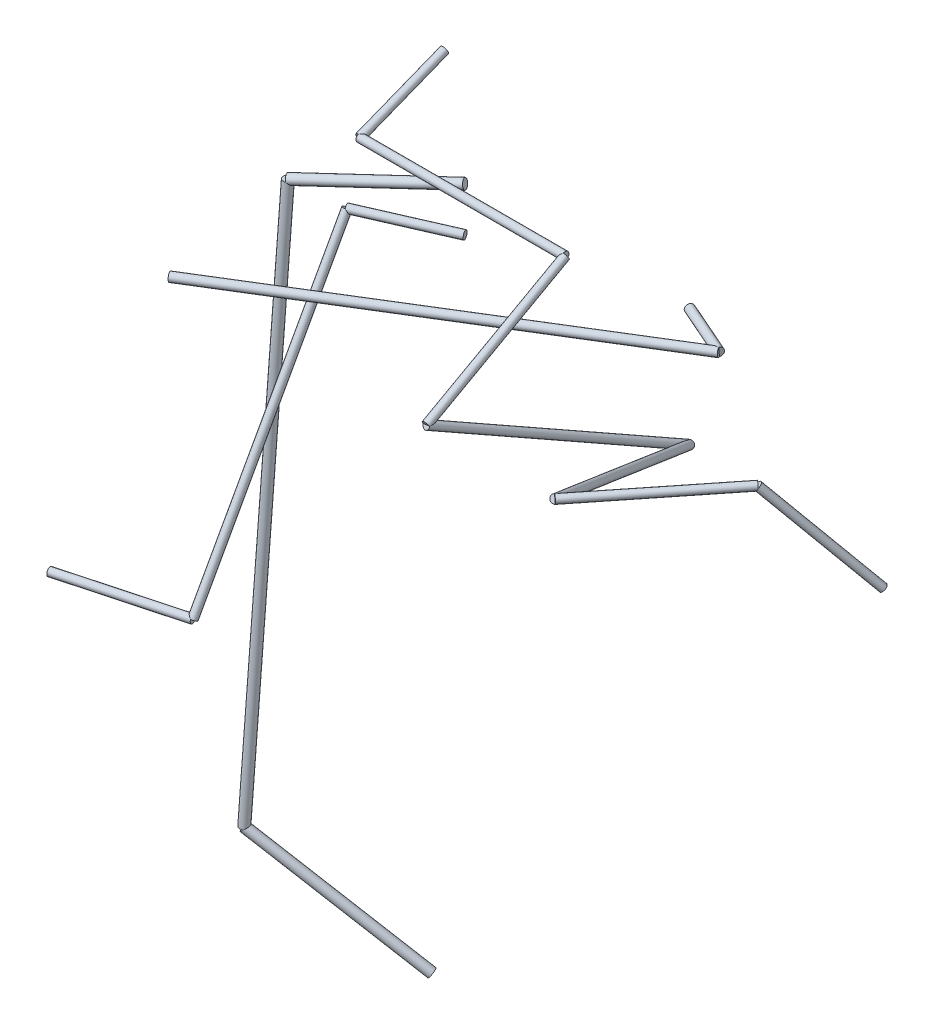
ISO-10303-21;
HEADER;
FILE_DESCRIPTION(('STEP AP214'),'2;1');
FILE_NAME('part.step','',(''),(''),'','','');
FILE_SCHEMA(('AUTOMOTIVE_DESIGN { 1 0 10303 214 1 1 1 1 }'));
ENDSEC;
DATA;
#1=APPLICATION_CONTEXT('core data for automotive mechanical design processes');
#2=APPLICATION_PROTOCOL_DEFINITION('international standard','automotive_design',2000,#1);
#3=PRODUCT_CONTEXT('',#1,'mechanical');
#4=PRODUCT('Part','Part','',(#3));
#5=PRODUCT_RELATED_PRODUCT_CATEGORY('part','',(#4));
#6=PRODUCT_DEFINITION_FORMATION('','',#4);
#7=PRODUCT_DEFINITION_CONTEXT('part definition',#1,'design');
#8=PRODUCT_DEFINITION('design','',#6,#7);
#9=PRODUCT_DEFINITION_SHAPE('','',#8);
#10=(LENGTH_UNIT() NAMED_UNIT(*) SI_UNIT(.MILLI.,.METRE.));
#11=(NAMED_UNIT(*) PLANE_ANGLE_UNIT() SI_UNIT($,.RADIAN.));
#12=(NAMED_UNIT(*) SI_UNIT($,.STERADIAN.) SOLID_ANGLE_UNIT());
#13=UNCERTAINTY_MEASURE_WITH_UNIT(LENGTH_MEASURE(1.E-05),#10,'distance_accuracy_value','');
#14=(GEOMETRIC_REPRESENTATION_CONTEXT(3) GLOBAL_UNCERTAINTY_ASSIGNED_CONTEXT((#13)) GLOBAL_UNIT_ASSIGNED_CONTEXT((#10,
#11,#12)) REPRESENTATION_CONTEXT('',''));
#15=CARTESIAN_POINT('',(0.,0.,0.));
#16=DIRECTION('',(0.,0.,1.));
#17=DIRECTION('',(1.,0.,0.));
#18=AXIS2_PLACEMENT_3D('',#15,#16,#17);
#19=CARTESIAN_POINT('',(-90.,105.,58.));
#20=DIRECTION('',(-0.886515391854037,-0.204977163864712,0.414819023551069));
#21=DIRECTION('',(0.423818055819128,0.,0.905747346428183));
#22=AXIS2_PLACEMENT_3D('',#19,#20,#21);
#23=PLANE('',#22);
#24=CARTESIAN_POINT('',(-90.,105.,58.));
#25=DIRECTION('',(0.886515391854037,0.204977163864712,-0.414819023551069));
#26=DIRECTION('',(-0.423818055819128,0.,-0.905747346428183));
#27=AXIS2_PLACEMENT_3D('',#24,#25,#26);
#28=CIRCLE('',#27,1.8);
#29=CARTESIAN_POINT('',(-89.2371274995256,105.,59.6303452235707));
#30=VERTEX_POINT('',#29);
#31=EDGE_CURVE('P0_E10',#30,#30,#28,.T.);
#32=ORIENTED_EDGE('',*,*,#31,.F.);
#33=EDGE_LOOP('',(#32));
#34=FACE_BOUND('',#33,.T.);
#35=ADVANCED_FACE('P0_F15',(#34),#23,.T.);
#36=CARTESIAN_POINT('',(-42.9835,115.871,36.));
#37=DIRECTION('',(0.886515391854037,0.204977163864712,-0.414819023551069));
#38=DIRECTION('',(-0.423818055819128,0.,-0.905747346428183));
#39=AXIS2_PLACEMENT_3D('',#36,#37,#38);
#40=PLANE('',#39);
#41=CARTESIAN_POINT('',(-42.9835,115.871,36.));
#42=DIRECTION('',(-0.886515391854037,-0.204977163864712,0.414819023551069));
#43=DIRECTION('',(0.423818055819128,0.,0.905747346428183));
#44=AXIS2_PLACEMENT_3D('',#41,#42,#43);
#45=CIRCLE('',#44,1.8);
#46=CARTESIAN_POINT('',(-42.2206274995256,115.871,37.6303452235707));
#47=VERTEX_POINT('',#46);
#48=EDGE_CURVE('P0_E22',#47,#47,#45,.T.);
#49=ORIENTED_EDGE('',*,*,#48,.F.);
#50=EDGE_LOOP('',(#49));
#51=FACE_BOUND('',#50,.T.);
#52=ADVANCED_FACE('P0_F26',(#51),#40,.T.);
#53=CARTESIAN_POINT('',(-42.9835,115.871,36.));
#54=DIRECTION('',(-0.886515391854037,-0.204977163864712,0.414819023551069));
#55=DIRECTION('',(0.423818055819128,0.,0.905747346428183));
#56=AXIS2_PLACEMENT_3D('',#53,#54,#55);
#57=CYLINDRICAL_SURFACE('',#56,1.8);
#58=CARTESIAN_POINT('',(-89.2371274995256,105.,59.6303452235707));
#59=CARTESIAN_POINT('',(-88.7473722911922,105.113239583333,59.4011785569041));
#60=CARTESIAN_POINT('',(-88.2576170828589,105.226479166667,59.1720118902374));
#61=CARTESIAN_POINT('',(-87.2781066661922,105.452958333333,58.7136785569041));
#62=CARTESIAN_POINT('',(-86.7883514578589,105.566197916667,58.4845118902374));
#63=CARTESIAN_POINT('',(-85.8088410411922,105.792677083333,58.0261785569041));
#64=CARTESIAN_POINT('',(-85.3190858328589,105.905916666667,57.7970118902374));
#65=CARTESIAN_POINT('',(-84.3395754161922,106.132395833333,57.3386785569041));
#66=CARTESIAN_POINT('',(-83.8498202078589,106.245635416667,57.1095118902374));
#67=CARTESIAN_POINT('',(-82.8703097911922,106.472114583333,56.6511785569041));
#68=CARTESIAN_POINT('',(-82.3805545828589,106.585354166667,56.4220118902374));
#69=CARTESIAN_POINT('',(-81.4010441661922,106.811833333333,55.9636785569041));
#70=CARTESIAN_POINT('',(-80.9112889578589,106.925072916667,55.7345118902374));
#71=CARTESIAN_POINT('',(-79.9317785411922,107.151552083333,55.2761785569041));
#72=CARTESIAN_POINT('',(-79.4420233328589,107.264791666667,55.0470118902374));
#73=CARTESIAN_POINT('',(-78.4625129161922,107.491270833333,54.5886785569041));
#74=CARTESIAN_POINT('',(-77.9727577078589,107.604510416667,54.3595118902374));
#75=CARTESIAN_POINT('',(-76.9932472911922,107.830989583333,53.9011785569041));
#76=CARTESIAN_POINT('',(-76.5034920828589,107.944229166667,53.6720118902374));
#77=CARTESIAN_POINT('',(-75.5239816661922,108.170708333333,53.2136785569041));
#78=CARTESIAN_POINT('',(-75.0342264578589,108.283947916667,52.9845118902374));
#79=CARTESIAN_POINT('',(-74.0547160411922,108.510427083333,52.5261785569041));
#80=CARTESIAN_POINT('',(-73.5649608328589,108.623666666667,52.2970118902374));
#81=CARTESIAN_POINT('',(-72.5854504161922,108.850145833333,51.8386785569041));
#82=CARTESIAN_POINT('',(-72.0956952078589,108.963385416667,51.6095118902374));
#83=CARTESIAN_POINT('',(-71.1161847911922,109.189864583333,51.1511785569041));
#84=CARTESIAN_POINT('',(-70.6264295828589,109.303104166667,50.9220118902374));
#85=CARTESIAN_POINT('',(-69.6469191661922,109.529583333333,50.4636785569041));
#86=CARTESIAN_POINT('',(-69.1571639578589,109.642822916667,50.2345118902374));
#87=CARTESIAN_POINT('',(-68.1776535411922,109.869302083333,49.7761785569041));
#88=CARTESIAN_POINT('',(-67.6878983328589,109.982541666667,49.5470118902374));
#89=CARTESIAN_POINT('',(-66.7083879161922,110.209020833333,49.0886785569041));
#90=CARTESIAN_POINT('',(-66.2186327078589,110.322260416667,48.8595118902374));
#91=CARTESIAN_POINT('',(-65.2391222911922,110.548739583333,48.4011785569041));
#92=CARTESIAN_POINT('',(-64.7493670828589,110.661979166667,48.1720118902374));
#93=CARTESIAN_POINT('',(-63.7698566661922,110.888458333333,47.7136785569041));
#94=CARTESIAN_POINT('',(-63.2801014578589,111.001697916667,47.4845118902374));
#95=CARTESIAN_POINT('',(-62.3005910411922,111.228177083333,47.0261785569041));
#96=CARTESIAN_POINT('',(-61.8108358328589,111.341416666667,46.7970118902374));
#97=CARTESIAN_POINT('',(-60.8313254161922,111.567895833333,46.3386785569041));
#98=CARTESIAN_POINT('',(-60.3415702078589,111.681135416667,46.1095118902374));
#99=CARTESIAN_POINT('',(-59.3620597911922,111.907614583333,45.6511785569041));
#100=CARTESIAN_POINT('',(-58.8723045828589,112.020854166667,45.4220118902374));
#101=CARTESIAN_POINT('',(-57.8927941661922,112.247333333333,44.9636785569041));
#102=CARTESIAN_POINT('',(-57.4030389578589,112.360572916667,44.7345118902374));
#103=CARTESIAN_POINT('',(-56.4235285411922,112.587052083333,44.2761785569041));
#104=CARTESIAN_POINT('',(-55.9337733328589,112.700291666667,44.0470118902374));
#105=CARTESIAN_POINT('',(-54.9542629161922,112.926770833333,43.5886785569041));
#106=CARTESIAN_POINT('',(-54.4645077078589,113.040010416667,43.3595118902374));
#107=CARTESIAN_POINT('',(-53.4849972911922,113.266489583333,42.9011785569041));
#108=CARTESIAN_POINT('',(-52.9952420828589,113.379729166667,42.6720118902374));
#109=CARTESIAN_POINT('',(-52.0157316661922,113.606208333333,42.2136785569041));
#110=CARTESIAN_POINT('',(-51.5259764578589,113.719447916667,41.9845118902374));
#111=CARTESIAN_POINT('',(-50.5464660411922,113.945927083333,41.5261785569041));
#112=CARTESIAN_POINT('',(-50.0567108328589,114.059166666667,41.2970118902374));
#113=CARTESIAN_POINT('',(-49.0772004161922,114.285645833333,40.8386785569041));
#114=CARTESIAN_POINT('',(-48.5874452078589,114.398885416667,40.6095118902374));
#115=CARTESIAN_POINT('',(-47.6079347911922,114.625364583333,40.151178556904));
#116=CARTESIAN_POINT('',(-47.1181795828589,114.738604166667,39.9220118902374));
#117=CARTESIAN_POINT('',(-46.1386691661922,114.965083333333,39.463678556904));
#118=CARTESIAN_POINT('',(-45.6489139578589,115.078322916667,39.2345118902374));
#119=CARTESIAN_POINT('',(-44.6694035411922,115.304802083333,38.7761785569041));
#120=CARTESIAN_POINT('',(-44.1796483328589,115.418041666667,38.5470118902374));
#121=CARTESIAN_POINT('',(-43.2001379161922,115.644520833333,38.0886785569041));
#122=CARTESIAN_POINT('',(-42.7103827078589,115.757760416667,37.8595118902374));
#123=CARTESIAN_POINT('',(-42.2206274995256,115.871,37.6303452235707));
#124=B_SPLINE_CURVE_WITH_KNOTS('',3,(#58,#59,#60,#61,#62,#63,#64,#65,#66,#67,#68,#69,#70,#71,
#72,#73,#74,#75,#76,#77,#78,#79,#80,#81,#82,#83,#84,#85,#86,#87,#88,#89,#90,#91,#92,#93,#94,#95,
#96,#97,#98,#99,#100,#101,#102,#103,#104,#105,#106,#107,#108,#109,#110,#111,#112,#113,#114,#115,
#116,#117,#118,#119,#120,#121,#122,#123),.UNSPECIFIED.,.F.,.F.,(4,2,2,2,2,2,2,2,2,2,2,2,2,2,2,2,
2,2,2,2,2,2,2,2,2,2,2,2,2,2,2,2,4),(0.,1.65734925586256,3.31469851172512,4.97204776758769,
6.62939702345026,8.28674627931283,9.94409553517539,11.6014447910379,13.2587940469005,
14.9161433027631,16.5734925586257,18.2308418144882,19.8881910703508,21.5455403262133,
23.2028895820759,24.8602388379385,26.5175880938011,28.1749373496636,29.8322866055262,
31.4896358613888,33.1469851172513,34.8043343731139,36.4616836289765,38.119032884839,
39.7763821407016,41.4337313965642,43.0910806524267,44.7484299082893,46.4057791641519,
48.0631284200144,49.720477675877,51.3778269317396,53.0351761876021),.UNSPECIFIED.);
#125=EDGE_CURVE('P0_BSEAM17',#30,#47,#124,.T.);
#126=ORIENTED_EDGE('',*,*,#31,.T.);
#127=ORIENTED_EDGE('',*,*,#48,.T.);
#128=ORIENTED_EDGE('',*,*,#125,.T.);
#129=ORIENTED_EDGE('',*,*,#125,.F.);
#130=EDGE_LOOP('',(#126,#128,#127,#129));
#131=FACE_BOUND('',#130,.T.);
#132=ADVANCED_FACE('P0_F17',(#131),#57,.T.);
#133=CLOSED_SHELL('',(#35,#52,#132));
#134=MANIFOLD_SOLID_BREP('P0_B1',#133);
#135=CARTESIAN_POINT('',(-95.,-110.,70.));
#136=DIRECTION('',(-0.0232134181882093,-0.998176982093001,0.0557122036517024));
#137=DIRECTION('',(0.,-0.0557272203375055,-0.998446031046974));
#138=AXIS2_PLACEMENT_3D('',#135,#136,#137);
#139=PLANE('',#138);
#140=CARTESIAN_POINT('',(-95.,-110.,70.));
#141=DIRECTION('',(0.0232134181882093,0.998176982093001,-0.0557122036517024));
#142=DIRECTION('',(0.,0.0557272203375055,0.998446031046974));
#143=AXIS2_PLACEMENT_3D('',#140,#141,#142);
#144=CIRCLE('',#143,1.8);
#145=CARTESIAN_POINT('',(-95.,-109.899691003392,71.7972028558846));
#146=VERTEX_POINT('',#145);
#147=EDGE_CURVE('P1_E10',#146,#146,#144,.T.);
#148=ORIENTED_EDGE('',*,*,#147,.F.);
#149=EDGE_LOOP('',(#148));
#150=FACE_BOUND('',#149,.T.);
#151=ADVANCED_FACE('P1_F15',(#150),#139,.T.);
#152=CARTESIAN_POINT('',(-90.,105.,58.));
#153=DIRECTION('',(0.0232134181882093,0.998176982093001,-0.0557122036517024));
#154=DIRECTION('',(0.,0.0557272203375055,0.998446031046974));
#155=AXIS2_PLACEMENT_3D('',#152,#153,#154);
#156=PLANE('',#155);
#157=CARTESIAN_POINT('',(-90.,105.,58.));
#158=DIRECTION('',(-0.0232134181882093,-0.998176982093001,0.0557122036517024));
#159=DIRECTION('',(0.,-0.0557272203375055,-0.998446031046974));
#160=AXIS2_PLACEMENT_3D('',#157,#158,#159);
#161=CIRCLE('',#160,1.8);
#162=CARTESIAN_POINT('',(-90.,104.899691003392,56.2027971441155));
#163=VERTEX_POINT('',#162);
#164=EDGE_CURVE('P1_E22',#163,#163,#161,.T.);
#165=ORIENTED_EDGE('',*,*,#164,.F.);
#166=EDGE_LOOP('',(#165));
#167=FACE_BOUND('',#166,.T.);
#168=ADVANCED_FACE('P1_F26',(#167),#156,.T.);
#169=CARTESIAN_POINT('',(-90.,105.,58.));
#170=DIRECTION('',(-0.0232134181882093,-0.998176982093001,0.0557122036517024));
#171=DIRECTION('',(0.,-0.0557272203375055,-0.998446031046974));
#172=AXIS2_PLACEMENT_3D('',#169,#170,#171);
#173=CYLINDRICAL_SURFACE('',#172,1.8);
#174=ORIENTED_EDGE('',*,*,#147,.T.);
#175=EDGE_LOOP('',(#174));
#176=FACE_BOUND('',#175,.T.);
#177=ORIENTED_EDGE('',*,*,#164,.T.);
#178=EDGE_LOOP('',(#177));
#179=FACE_BOUND('',#178,.T.);
#180=ADVANCED_FACE('P1_F17',(#176,#179),#173,.T.);
#181=CLOSED_SHELL('',(#151,#168,#180));
#182=MANIFOLD_SOLID_BREP('P1_B1',#181);
#183=CARTESIAN_POINT('',(-48.,-148.937,43.8614));
#184=DIRECTION('',(0.707882995651869,-0.586443408546741,-0.393682350428637));
#185=DIRECTION('',(0.637960961575174,0.770068705704938,0.));
#186=AXIS2_PLACEMENT_3D('',#183,#184,#185);
#187=PLANE('',#186);
#188=CARTESIAN_POINT('',(-48.,-148.937,43.8614));
#189=DIRECTION('',(-0.707882995651869,0.586443408546741,0.393682350428637));
#190=DIRECTION('',(-0.637960961575174,-0.770068705704938,0.));
#191=AXIS2_PLACEMENT_3D('',#188,#189,#190);
#192=CIRCLE('',#191,1.8);
#193=CARTESIAN_POINT('',(-49.1483297308353,-150.323123670269,43.8614));
#194=VERTEX_POINT('',#193);
#195=EDGE_CURVE('P2_E10',#194,#194,#192,.T.);
#196=ORIENTED_EDGE('',*,*,#195,.F.);
#197=EDGE_LOOP('',(#196));
#198=FACE_BOUND('',#197,.T.);
#199=ADVANCED_FACE('P2_F15',(#198),#187,.T.);
#200=CARTESIAN_POINT('',(-95.,-110.,70.));
#201=DIRECTION('',(-0.707882995651869,0.586443408546741,0.393682350428637));
#202=DIRECTION('',(-0.637960961575174,-0.770068705704938,0.));
#203=AXIS2_PLACEMENT_3D('',#200,#201,#202);
#204=PLANE('',#203);
#205=CARTESIAN_POINT('',(-95.,-110.,70.));
#206=DIRECTION('',(0.707882995651869,-0.586443408546741,-0.393682350428637));
#207=DIRECTION('',(0.637960961575174,0.770068705704938,0.));
#208=AXIS2_PLACEMENT_3D('',#205,#206,#207);
#209=CIRCLE('',#208,1.8);
#210=CARTESIAN_POINT('',(-93.8516702691647,-108.613876329731,70.));
#211=VERTEX_POINT('',#210);
#212=EDGE_CURVE('P2_E22',#211,#211,#209,.T.);
#213=ORIENTED_EDGE('',*,*,#212,.F.);
#214=EDGE_LOOP('',(#213));
#215=FACE_BOUND('',#214,.T.);
#216=ADVANCED_FACE('P2_F26',(#215),#204,.T.);
#217=CARTESIAN_POINT('',(-95.,-110.,70.));
#218=DIRECTION('',(0.707882995651869,-0.586443408546741,-0.393682350428637));
#219=DIRECTION('',(0.637960961575174,0.770068705704938,0.));
#220=AXIS2_PLACEMENT_3D('',#217,#218,#219);
#221=CYLINDRICAL_SURFACE('',#220,1.8);
#222=ORIENTED_EDGE('',*,*,#195,.T.);
#223=EDGE_LOOP('',(#222));
#224=FACE_BOUND('',#223,.T.);
#225=ORIENTED_EDGE('',*,*,#212,.T.);
#226=EDGE_LOOP('',(#225));
#227=FACE_BOUND('',#226,.T.);
#228=ADVANCED_FACE('P2_F17',(#224,#227),#221,.T.);
#229=CLOSED_SHELL('',(#199,#216,#228));
#230=MANIFOLD_SOLID_BREP('P2_B1',#229);
#231=CARTESIAN_POINT('',(-75.,98.599,50.));
#232=DIRECTION('',(-0.916233178407609,0.,0.400645432752066));
#233=DIRECTION('',(0.400645432752066,0.,0.916233178407609));
#234=AXIS2_PLACEMENT_3D('',#231,#232,#233);
#235=PLANE('',#234);
#236=CARTESIAN_POINT('',(-75.,98.599,50.));
#237=DIRECTION('',(0.916233178407609,0.,-0.400645432752066));
#238=DIRECTION('',(-0.400645432752066,0.,-0.916233178407609));
#239=AXIS2_PLACEMENT_3D('',#236,#237,#238);
#240=CIRCLE('',#239,1.5);
#241=CARTESIAN_POINT('',(-75.6009681491281,98.599,48.6256502323886));
#242=VERTEX_POINT('',#241);
#243=EDGE_CURVE('P3_E10',#242,#242,#240,.T.);
#244=ORIENTED_EDGE('',*,*,#243,.F.);
#245=EDGE_LOOP('',(#244));
#246=FACE_BOUND('',#245,.T.);
#247=ADVANCED_FACE('P3_F15',(#246),#235,.T.);
#248=CARTESIAN_POINT('',(-42.9835,98.599,36.));
#249=DIRECTION('',(0.916233178407609,0.,-0.400645432752066));
#250=DIRECTION('',(-0.400645432752066,0.,-0.916233178407609));
#251=AXIS2_PLACEMENT_3D('',#248,#249,#250);
#252=PLANE('',#251);
#253=CARTESIAN_POINT('',(-42.9835,98.599,36.));
#254=DIRECTION('',(-0.916233178407609,0.,0.400645432752066));
#255=DIRECTION('',(0.400645432752066,0.,0.916233178407609));
#256=AXIS2_PLACEMENT_3D('',#253,#254,#255);
#257=CIRCLE('',#256,1.5);
#258=CARTESIAN_POINT('',(-42.3825318508719,98.599,37.3743497676114));
#259=VERTEX_POINT('',#258);
#260=EDGE_CURVE('P3_E22',#259,#259,#257,.T.);
#261=ORIENTED_EDGE('',*,*,#260,.F.);
#262=EDGE_LOOP('',(#261));
#263=FACE_BOUND('',#262,.T.);
#264=ADVANCED_FACE('P3_F26',(#263),#252,.T.);
#265=CARTESIAN_POINT('',(-42.9835,98.599,36.));
#266=DIRECTION('',(-0.916233178407609,0.,0.400645432752066));
#267=DIRECTION('',(0.400645432752066,0.,0.916233178407609));
#268=AXIS2_PLACEMENT_3D('',#265,#266,#267);
#269=CYLINDRICAL_SURFACE('',#268,1.5);
#270=ORIENTED_EDGE('',*,*,#243,.T.);
#271=EDGE_LOOP('',(#270));
#272=FACE_BOUND('',#271,.T.);
#273=ORIENTED_EDGE('',*,*,#260,.T.);
#274=EDGE_LOOP('',(#273));
#275=FACE_BOUND('',#274,.T.);
#276=ADVANCED_FACE('P3_F17',(#272,#275),#269,.T.);
#277=CLOSED_SHELL('',(#247,#264,#276));
#278=MANIFOLD_SOLID_BREP('P3_B1',#277);
#279=CARTESIAN_POINT('',(-75.,-10.,110.));
#280=DIRECTION('',(0.,-0.875293519733741,0.483592032928705));
#281=DIRECTION('',(0.,-0.483592032928706,-0.875293519733742));
#282=AXIS2_PLACEMENT_3D('',#279,#280,#281);
#283=PLANE('',#282);
#284=CARTESIAN_POINT('',(-75.,-10.,110.));
#285=DIRECTION('',(0.,0.875293519733741,-0.483592032928705));
#286=DIRECTION('',(0.,0.483592032928706,0.875293519733742));
#287=AXIS2_PLACEMENT_3D('',#284,#285,#286);
#288=CIRCLE('',#287,1.5);
#289=CARTESIAN_POINT('',(-75.,-10.7253880493931,108.687059720399));
#290=VERTEX_POINT('',#289);
#291=EDGE_CURVE('P4_E10',#290,#290,#288,.T.);
#292=ORIENTED_EDGE('',*,*,#291,.F.);
#293=EDGE_LOOP('',(#292));
#294=FACE_BOUND('',#293,.T.);
#295=ADVANCED_FACE('P4_F15',(#294),#283,.T.);
#296=CARTESIAN_POINT('',(-75.,98.599,50.));
#297=DIRECTION('',(0.,0.875293519733741,-0.483592032928705));
#298=DIRECTION('',(0.,0.483592032928706,0.875293519733742));
#299=AXIS2_PLACEMENT_3D('',#296,#297,#298);
#300=PLANE('',#299);
#301=CARTESIAN_POINT('',(-75.,98.599,50.));
#302=DIRECTION('',(0.,-0.875293519733741,0.483592032928705));
#303=DIRECTION('',(0.,-0.483592032928706,-0.875293519733742));
#304=AXIS2_PLACEMENT_3D('',#301,#302,#303);
#305=CIRCLE('',#304,1.5);
#306=CARTESIAN_POINT('',(-75.,97.8736119506069,48.6870597203994));
#307=VERTEX_POINT('',#306);
#308=EDGE_CURVE('P4_E22',#307,#307,#305,.T.);
#309=ORIENTED_EDGE('',*,*,#308,.F.);
#310=EDGE_LOOP('',(#309));
#311=FACE_BOUND('',#310,.T.);
#312=ADVANCED_FACE('P4_F26',(#311),#300,.T.);
#313=CARTESIAN_POINT('',(-75.,98.599,50.));
#314=DIRECTION('',(0.,-0.875293519733741,0.483592032928705));
#315=DIRECTION('',(0.,-0.483592032928706,-0.875293519733742));
#316=AXIS2_PLACEMENT_3D('',#313,#314,#315);
#317=CYLINDRICAL_SURFACE('',#316,1.5);
#318=CARTESIAN_POINT('',(-75.,-10.7253880493931,108.687059720399));
#319=CARTESIAN_POINT('',(-75.,-9.59414846605975,108.062059720399));
#320=CARTESIAN_POINT('',(-75.,-8.46290888272642,107.437059720399));
#321=CARTESIAN_POINT('',(-75.,-6.20042971605975,106.187059720399));
#322=CARTESIAN_POINT('',(-75.,-5.06919013272641,105.562059720399));
#323=CARTESIAN_POINT('',(-75.,-2.80671096605975,104.312059720399));
#324=CARTESIAN_POINT('',(-75.,-1.67547138272642,103.687059720399));
#325=CARTESIAN_POINT('',(-75.,0.58700778394025,102.437059720399));
#326=CARTESIAN_POINT('',(-75.,1.71824736727359,101.812059720399));
#327=CARTESIAN_POINT('',(-75.,3.98072653394026,100.562059720399));
#328=CARTESIAN_POINT('',(-75.,5.11196611727359,99.9370597203994));
#329=CARTESIAN_POINT('',(-75.,7.37444528394026,98.6870597203994));
#330=CARTESIAN_POINT('',(-75.,8.50568486727359,98.0620597203994));
#331=CARTESIAN_POINT('',(-75.,10.7681640339403,96.8120597203994));
#332=CARTESIAN_POINT('',(-75.,11.8994036172736,96.1870597203994));
#333=CARTESIAN_POINT('',(-75.,14.1618827839403,94.9370597203994));
#334=CARTESIAN_POINT('',(-75.,15.2931223672736,94.3120597203994));
#335=CARTESIAN_POINT('',(-75.,17.5556015339403,93.0620597203994));
#336=CARTESIAN_POINT('',(-75.,18.6868411172736,92.4370597203994));
#337=CARTESIAN_POINT('',(-75.,20.9493202839403,91.1870597203994));
#338=CARTESIAN_POINT('',(-75.,22.0805598672736,90.5620597203994));
#339=CARTESIAN_POINT('',(-75.,24.3430390339403,89.3120597203994));
#340=CARTESIAN_POINT('',(-75.,25.4742786172736,88.6870597203994));
#341=CARTESIAN_POINT('',(-75.,27.7367577839403,87.4370597203994));
#342=CARTESIAN_POINT('',(-75.,28.8679973672736,86.8120597203994));
#343=CARTESIAN_POINT('',(-75.,31.1304765339403,85.5620597203994));
#344=CARTESIAN_POINT('',(-75.,32.2617161172736,84.9370597203994));
#345=CARTESIAN_POINT('',(-75.,34.5241952839403,83.6870597203994));
#346=CARTESIAN_POINT('',(-75.,35.6554348672736,83.0620597203994));
#347=CARTESIAN_POINT('',(-75.,37.9179140339403,81.8120597203994));
#348=CARTESIAN_POINT('',(-75.,39.0491536172736,81.1870597203994));
#349=CARTESIAN_POINT('',(-75.,41.3116327839403,79.9370597203994));
#350=CARTESIAN_POINT('',(-75.,42.4428723672736,79.3120597203994));
#351=CARTESIAN_POINT('',(-75.,44.7053515339403,78.0620597203994));
#352=CARTESIAN_POINT('',(-75.,45.8365911172736,77.4370597203994));
#353=CARTESIAN_POINT('',(-75.,48.0990702839403,76.1870597203994));
#354=CARTESIAN_POINT('',(-75.,49.2303098672736,75.5620597203994));
#355=CARTESIAN_POINT('',(-75.,51.4927890339403,74.3120597203994));
#356=CARTESIAN_POINT('',(-75.,52.6240286172736,73.6870597203994));
#357=CARTESIAN_POINT('',(-75.,54.8865077839403,72.4370597203994));
#358=CARTESIAN_POINT('',(-75.,56.0177473672736,71.8120597203994));
#359=CARTESIAN_POINT('',(-75.,58.2802265339403,70.5620597203994));
#360=CARTESIAN_POINT('',(-75.,59.4114661172736,69.9370597203994));
#361=CARTESIAN_POINT('',(-75.,61.6739452839403,68.6870597203994));
#362=CARTESIAN_POINT('',(-75.,62.8051848672736,68.0620597203994));
#363=CARTESIAN_POINT('',(-75.,65.0676640339403,66.8120597203994));
#364=CARTESIAN_POINT('',(-75.,66.1989036172736,66.1870597203994));
#365=CARTESIAN_POINT('',(-75.,68.4613827839403,64.9370597203994));
#366=CARTESIAN_POINT('',(-75.,69.5926223672736,64.3120597203994));
#367=CARTESIAN_POINT('',(-75.,71.8551015339403,63.0620597203994));
#368=CARTESIAN_POINT('',(-75.,72.9863411172736,62.4370597203994));
#369=CARTESIAN_POINT('',(-75.,75.2488202839403,61.1870597203994));
#370=CARTESIAN_POINT('',(-75.,76.3800598672736,60.5620597203994));
#371=CARTESIAN_POINT('',(-75.,78.6425390339403,59.3120597203994));
#372=CARTESIAN_POINT('',(-75.,79.7737786172736,58.6870597203994));
#373=CARTESIAN_POINT('',(-75.,82.0362577839403,57.4370597203994));
#374=CARTESIAN_POINT('',(-75.,83.1674973672736,56.8120597203994));
#375=CARTESIAN_POINT('',(-75.,85.4299765339403,55.5620597203994));
#376=CARTESIAN_POINT('',(-75.,86.5612161172736,54.9370597203994));
#377=CARTESIAN_POINT('',(-75.,88.8236952839403,53.6870597203994));
#378=CARTESIAN_POINT('',(-75.,89.9549348672736,53.0620597203994));
#379=CARTESIAN_POINT('',(-75.,92.2174140339403,51.8120597203994));
#380=CARTESIAN_POINT('',(-75.,93.3486536172736,51.1870597203994));
#381=CARTESIAN_POINT('',(-75.,95.6111327839403,49.9370597203994));
#382=CARTESIAN_POINT('',(-75.,96.7423723672736,49.3120597203994));
#383=CARTESIAN_POINT('',(-75.,97.8736119506069,48.6870597203994));
#384=B_SPLINE_CURVE_WITH_KNOTS('',3,(#318,#319,#320,#321,#322,#323,#324,#325,#326,#327,#328,
#329,#330,#331,#332,#333,#334,#335,#336,#337,#338,#339,#340,#341,#342,#343,#344,#345,#346,#347,
#348,#349,#350,#351,#352,#353,#354,#355,#356,#357,#358,#359,#360,#361,#362,#363,#364,#365,#366,
#367,#368,#369,#370,#371,#372,#373,#374,#375,#376,#377,#378,#379,#380,#381,#382,#383),
.UNSPECIFIED.,.F.,.F.,(4,2,2,2,2,2,2,2,2,2,2,2,2,2,2,2,2,2,2,2,2,2,2,2,2,2,2,2,2,2,2,2,4),(0.,
3.87723509141522,7.75447018283043,11.6317052742456,15.5089403656609,19.3861754570761,
23.2634105484913,27.1406456399065,31.0178807313217,34.895115822737,38.7723509141522,
42.6495860055674,46.5268210969826,50.4040561883978,54.281291279813,58.1585263712283,
62.0357614626435,65.9129965540587,69.7902316454739,73.6674667368891,77.5447018283043,
81.4219369197196,85.2991720111348,89.17640710255,93.0536421939652,96.9308772853804,
100.808112376796,104.685347468211,108.562582559626,112.439817651041,116.317052742457,
120.194287833872,124.071522925287),.UNSPECIFIED.);
#385=EDGE_CURVE('P4_BSEAM17',#290,#307,#384,.T.);
#386=ORIENTED_EDGE('',*,*,#291,.T.);
#387=ORIENTED_EDGE('',*,*,#308,.T.);
#388=ORIENTED_EDGE('',*,*,#385,.T.);
#389=ORIENTED_EDGE('',*,*,#385,.F.);
#390=EDGE_LOOP('',(#386,#388,#387,#389));
#391=FACE_BOUND('',#390,.T.);
#392=ADVANCED_FACE('P4_F17',(#391),#317,.T.);
#393=CLOSED_SHELL('',(#295,#312,#392));
#394=MANIFOLD_SOLID_BREP('P4_B1',#393);
#395=CARTESIAN_POINT('',(-119.,-10.,121.9));
#396=DIRECTION('',(-0.965318574726809,0.,0.261074796346569));
#397=DIRECTION('',(0.261074796346569,0.,0.965318574726809));
#398=AXIS2_PLACEMENT_3D('',#395,#396,#397);
#399=PLANE('',#398);
#400=CARTESIAN_POINT('',(-119.,-10.,121.9));
#401=DIRECTION('',(0.965318574726809,0.,-0.261074796346569));
#402=DIRECTION('',(-0.261074796346569,0.,-0.965318574726809));
#403=AXIS2_PLACEMENT_3D('',#400,#401,#402);
#404=CIRCLE('',#403,1.5);
#405=CARTESIAN_POINT('',(-119.39161219452,-10.,120.45202213791));
#406=VERTEX_POINT('',#405);
#407=EDGE_CURVE('P5_E10',#406,#406,#404,.T.);
#408=ORIENTED_EDGE('',*,*,#407,.F.);
#409=EDGE_LOOP('',(#408));
#410=FACE_BOUND('',#409,.T.);
#411=ADVANCED_FACE('P5_F15',(#410),#399,.T.);
#412=CARTESIAN_POINT('',(-75.,-10.,110.));
#413=DIRECTION('',(0.965318574726809,0.,-0.261074796346569));
#414=DIRECTION('',(-0.261074796346569,0.,-0.965318574726809));
#415=AXIS2_PLACEMENT_3D('',#412,#413,#414);
#416=PLANE('',#415);
#417=CARTESIAN_POINT('',(-75.,-10.,110.));
#418=DIRECTION('',(-0.965318574726809,0.,0.261074796346569));
#419=DIRECTION('',(0.261074796346569,0.,0.965318574726809));
#420=AXIS2_PLACEMENT_3D('',#417,#418,#419);
#421=CIRCLE('',#420,1.5);
#422=CARTESIAN_POINT('',(-74.6083878054801,-10.,111.44797786209));
#423=VERTEX_POINT('',#422);
#424=EDGE_CURVE('P5_E22',#423,#423,#421,.T.);
#425=ORIENTED_EDGE('',*,*,#424,.F.);
#426=EDGE_LOOP('',(#425));
#427=FACE_BOUND('',#426,.T.);
#428=ADVANCED_FACE('P5_F26',(#427),#416,.T.);
#429=CARTESIAN_POINT('',(-75.,-10.,110.));
#430=DIRECTION('',(-0.965318574726809,0.,0.261074796346569));
#431=DIRECTION('',(0.261074796346569,0.,0.965318574726809));
#432=AXIS2_PLACEMENT_3D('',#429,#430,#431);
#433=CYLINDRICAL_SURFACE('',#432,1.5);
#434=ORIENTED_EDGE('',*,*,#407,.T.);
#435=EDGE_LOOP('',(#434));
#436=FACE_BOUND('',#435,.T.);
#437=ORIENTED_EDGE('',*,*,#424,.T.);
#438=EDGE_LOOP('',(#437));
#439=FACE_BOUND('',#438,.T.);
#440=ADVANCED_FACE('P5_F17',(#436,#439),#433,.T.);
#441=CLOSED_SHELL('',(#411,#428,#440));
#442=MANIFOLD_SOLID_BREP('P5_B1',#441);
#443=CARTESIAN_POINT('',(65.,117.6,45.));
#444=DIRECTION('',(0.915611440496237,0.000469074681037513,0.402064012318125));
#445=DIRECTION('',(0.402064056551417,0.,-0.91561154122773));
#446=AXIS2_PLACEMENT_3D('',#443,#444,#445);
#447=PLANE('',#446);
#448=CARTESIAN_POINT('',(65.,117.6,45.));
#449=DIRECTION('',(-0.915611440496237,-0.000469074681037513,-0.402064012318125));
#450=DIRECTION('',(-0.402064056551417,0.,0.91561154122773));
#451=AXIS2_PLACEMENT_3D('',#448,#449,#450);
#452=CIRCLE('',#451,1.6);
#453=CARTESIAN_POINT('',(64.3566975095177,117.6,46.4649784659644));
#454=VERTEX_POINT('',#453);
#455=EDGE_CURVE('P6_E10',#454,#454,#452,.T.);
#456=ORIENTED_EDGE('',*,*,#455,.F.);
#457=EDGE_LOOP('',(#456));
#458=FACE_BOUND('',#457,.T.);
#459=ADVANCED_FACE('P6_F15',(#458),#447,.T.);
#460=CARTESIAN_POINT('',(44.5045,117.5895,36.));
#461=DIRECTION('',(-0.915611440496237,-0.000469074681037513,-0.402064012318125));
#462=DIRECTION('',(-0.402064056551417,0.,0.91561154122773));
#463=AXIS2_PLACEMENT_3D('',#460,#461,#462);
#464=PLANE('',#463);
#465=CARTESIAN_POINT('',(44.5045,117.5895,36.));
#466=DIRECTION('',(0.915611440496237,0.000469074681037513,0.402064012318125));
#467=DIRECTION('',(0.402064056551417,0.,-0.91561154122773));
#468=AXIS2_PLACEMENT_3D('',#465,#466,#467);
#469=CIRCLE('',#468,1.6);
#470=CARTESIAN_POINT('',(45.1478024904823,117.5895,34.5350215340356));
#471=VERTEX_POINT('',#470);
#472=EDGE_CURVE('P6_E22',#471,#471,#469,.T.);
#473=ORIENTED_EDGE('',*,*,#472,.F.);
#474=EDGE_LOOP('',(#473));
#475=FACE_BOUND('',#474,.T.);
#476=ADVANCED_FACE('P6_F26',(#475),#464,.T.);
#477=CARTESIAN_POINT('',(44.5045,117.5895,36.));
#478=DIRECTION('',(0.915611440496237,0.000469074681037513,0.402064012318125));
#479=DIRECTION('',(0.402064056551417,0.,-0.91561154122773));
#480=AXIS2_PLACEMENT_3D('',#477,#478,#479);
#481=CYLINDRICAL_SURFACE('',#480,1.6);
#482=ORIENTED_EDGE('',*,*,#455,.T.);
#483=EDGE_LOOP('',(#482));
#484=FACE_BOUND('',#483,.T.);
#485=ORIENTED_EDGE('',*,*,#472,.T.);
#486=EDGE_LOOP('',(#485));
#487=FACE_BOUND('',#486,.T.);
#488=ADVANCED_FACE('P6_F17',(#484,#487),#481,.T.);
#489=CLOSED_SHELL('',(#459,#476,#488));
#490=MANIFOLD_SOLID_BREP('P6_B1',#489);
#491=CARTESIAN_POINT('',(-75.,110.,119.));
#492=DIRECTION('',(-0.883078484820893,-0.0479385463188484,0.466770056262472));
#493=DIRECTION('',(0.467307325584463,0.,0.88409494029493));
#494=AXIS2_PLACEMENT_3D('',#491,#492,#493);
#495=PLANE('',#494);
#496=CARTESIAN_POINT('',(-75.,110.,119.));
#497=DIRECTION('',(0.883078484820893,0.0479385463188484,-0.466770056262472));
#498=DIRECTION('',(-0.467307325584463,0.,-0.88409494029493));
#499=AXIS2_PLACEMENT_3D('',#496,#497,#498);
#500=CIRCLE('',#499,1.6);
#501=CARTESIAN_POINT('',(-75.7476917209352,110.,117.585448095528));
#502=VERTEX_POINT('',#501);
#503=EDGE_CURVE('P7_E10',#502,#502,#500,.T.);
#504=ORIENTED_EDGE('',*,*,#503,.F.);
#505=EDGE_LOOP('',(#504));
#506=FACE_BOUND('',#505,.T.);
#507=ADVANCED_FACE('P7_F15',(#506),#495,.T.);
#508=CARTESIAN_POINT('',(65.,117.6,45.));
#509=DIRECTION('',(0.883078484820893,0.0479385463188484,-0.466770056262472));
#510=DIRECTION('',(-0.467307325584463,0.,-0.88409494029493));
#511=AXIS2_PLACEMENT_3D('',#508,#509,#510);
#512=PLANE('',#511);
#513=CARTESIAN_POINT('',(65.,117.6,45.));
#514=DIRECTION('',(-0.883078484820893,-0.0479385463188484,0.466770056262472));
#515=DIRECTION('',(0.467307325584463,0.,0.88409494029493));
#516=AXIS2_PLACEMENT_3D('',#513,#514,#515);
#517=CIRCLE('',#516,1.6);
#518=CARTESIAN_POINT('',(65.7476917209351,117.6,46.4145519044719));
#519=VERTEX_POINT('',#518);
#520=EDGE_CURVE('P7_E22',#519,#519,#517,.T.);
#521=ORIENTED_EDGE('',*,*,#520,.F.);
#522=EDGE_LOOP('',(#521));
#523=FACE_BOUND('',#522,.T.);
#524=ADVANCED_FACE('P7_F26',(#523),#512,.T.);
#525=CARTESIAN_POINT('',(65.,117.6,45.));
#526=DIRECTION('',(-0.883078484820893,-0.0479385463188484,0.466770056262472));
#527=DIRECTION('',(0.467307325584463,0.,0.88409494029493));
#528=AXIS2_PLACEMENT_3D('',#525,#526,#527);
#529=CYLINDRICAL_SURFACE('',#528,1.6);
#530=ORIENTED_EDGE('',*,*,#503,.T.);
#531=EDGE_LOOP('',(#530));
#532=FACE_BOUND('',#531,.T.);
#533=ORIENTED_EDGE('',*,*,#520,.T.);
#534=EDGE_LOOP('',(#533));
#535=FACE_BOUND('',#534,.T.);
#536=ADVANCED_FACE('P7_F17',(#532,#535),#529,.T.);
#537=CLOSED_SHELL('',(#507,#524,#536));
#538=MANIFOLD_SOLID_BREP('P7_B1',#537);
#539=CARTESIAN_POINT('',(25.,110.,119.));
#540=DIRECTION('',(-0.208229551364339,0.411139623316946,0.887470937032535));
#541=DIRECTION('',(0.,-0.907360289638555,0.420353785265505));
#542=AXIS2_PLACEMENT_3D('',#539,#540,#541);
#543=PLANE('',#542);
#544=CARTESIAN_POINT('',(25.,110.,119.));
#545=DIRECTION('',(0.208229551364339,-0.411139623316946,-0.887470937032535));
#546=DIRECTION('',(0.,0.907360289638555,-0.420353785265505));
#547=AXIS2_PLACEMENT_3D('',#544,#545,#546);
#548=CIRCLE('',#547,1.5);
#549=CARTESIAN_POINT('',(25.,111.361040434458,118.369469322102));
#550=VERTEX_POINT('',#549);
#551=EDGE_CURVE('P8_E10',#550,#550,#548,.T.);
#552=ORIENTED_EDGE('',*,*,#551,.F.);
#553=EDGE_LOOP('',(#552));
#554=FACE_BOUND('',#553,.T.);
#555=ADVANCED_FACE('P8_F15',(#554),#543,.T.);
#556=CARTESIAN_POINT('',(44.4745,71.5485,36.));
#557=DIRECTION('',(0.208229551364339,-0.411139623316946,-0.887470937032535));
#558=DIRECTION('',(0.,0.907360289638555,-0.420353785265505));
#559=AXIS2_PLACEMENT_3D('',#556,#557,#558);
#560=PLANE('',#559);
#561=CARTESIAN_POINT('',(44.4745,71.5485,36.));
#562=DIRECTION('',(-0.208229551364339,0.411139623316946,0.887470937032535));
#563=DIRECTION('',(0.,-0.907360289638555,0.420353785265505));
#564=AXIS2_PLACEMENT_3D('',#561,#562,#563);
#565=CIRCLE('',#564,1.5);
#566=CARTESIAN_POINT('',(44.4745,70.1874595655422,36.6305306778982));
#567=VERTEX_POINT('',#566);
#568=EDGE_CURVE('P8_E22',#567,#567,#565,.T.);
#569=ORIENTED_EDGE('',*,*,#568,.F.);
#570=EDGE_LOOP('',(#569));
#571=FACE_BOUND('',#570,.T.);
#572=ADVANCED_FACE('P8_F26',(#571),#560,.T.);
#573=CARTESIAN_POINT('',(44.4745,71.5485,36.));
#574=DIRECTION('',(-0.208229551364339,0.411139623316946,0.887470937032535));
#575=DIRECTION('',(0.,-0.907360289638555,0.420353785265505));
#576=AXIS2_PLACEMENT_3D('',#573,#574,#575);
#577=CYLINDRICAL_SURFACE('',#576,1.5);
#578=ORIENTED_EDGE('',*,*,#551,.T.);
#579=EDGE_LOOP('',(#578));
#580=FACE_BOUND('',#579,.T.);
#581=ORIENTED_EDGE('',*,*,#568,.T.);
#582=EDGE_LOOP('',(#581));
#583=FACE_BOUND('',#582,.T.);
#584=ADVANCED_FACE('P8_F17',(#580,#583),#577,.T.);
#585=CLOSED_SHELL('',(#555,#572,#584));
#586=MANIFOLD_SOLID_BREP('P8_B1',#585);
#587=CARTESIAN_POINT('',(75.,110.,119.));
#588=DIRECTION('',(0.316546194323574,0.398737972876215,0.860701188477064));
#589=DIRECTION('',(0.,-0.907360289638555,0.420353785265505));
#590=AXIS2_PLACEMENT_3D('',#587,#588,#589);
#591=PLANE('',#590);
#592=CARTESIAN_POINT('',(75.,110.,119.));
#593=DIRECTION('',(-0.316546194323574,-0.398737972876215,-0.860701188477064));
#594=DIRECTION('',(0.,0.907360289638555,-0.420353785265505));
#595=AXIS2_PLACEMENT_3D('',#592,#593,#594);
#596=CIRCLE('',#595,1.5);
#597=CARTESIAN_POINT('',(75.,111.361040434458,118.369469322102));
#598=VERTEX_POINT('',#597);
#599=EDGE_CURVE('P9_E10',#598,#598,#596,.T.);
#600=ORIENTED_EDGE('',*,*,#599,.F.);
#601=EDGE_LOOP('',(#600));
#602=FACE_BOUND('',#601,.T.);
#603=ADVANCED_FACE('P9_F15',(#602),#591,.T.);
#604=CARTESIAN_POINT('',(44.4745,71.5485,36.));
#605=DIRECTION('',(-0.316546194323574,-0.398737972876215,-0.860701188477064));
#606=DIRECTION('',(0.,0.907360289638555,-0.420353785265505));
#607=AXIS2_PLACEMENT_3D('',#604,#605,#606);
#608=PLANE('',#607);
#609=CARTESIAN_POINT('',(44.4745,71.5485,36.));
#610=DIRECTION('',(0.316546194323574,0.398737972876215,0.860701188477064));
#611=DIRECTION('',(0.,-0.907360289638555,0.420353785265505));
#612=AXIS2_PLACEMENT_3D('',#609,#610,#611);
#613=CIRCLE('',#612,1.5);
#614=CARTESIAN_POINT('',(44.4745,70.1874595655422,36.6305306778982));
#615=VERTEX_POINT('',#614);
#616=EDGE_CURVE('P9_E22',#615,#615,#613,.T.);
#617=ORIENTED_EDGE('',*,*,#616,.F.);
#618=EDGE_LOOP('',(#617));
#619=FACE_BOUND('',#618,.T.);
#620=ADVANCED_FACE('P9_F26',(#619),#608,.T.);
#621=CARTESIAN_POINT('',(44.4745,71.5485,36.));
#622=DIRECTION('',(0.316546194323574,0.398737972876215,0.860701188477064));
#623=DIRECTION('',(0.,-0.907360289638555,0.420353785265505));
#624=AXIS2_PLACEMENT_3D('',#621,#622,#623);
#625=CYLINDRICAL_SURFACE('',#624,1.5);
#626=ORIENTED_EDGE('',*,*,#599,.T.);
#627=EDGE_LOOP('',(#626));
#628=FACE_BOUND('',#627,.T.);
#629=ORIENTED_EDGE('',*,*,#616,.T.);
#630=EDGE_LOOP('',(#629));
#631=FACE_BOUND('',#630,.T.);
#632=ADVANCED_FACE('P9_F17',(#628,#631),#625,.T.);
#633=CLOSED_SHELL('',(#603,#620,#632));
#634=MANIFOLD_SOLID_BREP('P9_B1',#633);
#635=CARTESIAN_POINT('',(110.,110.,75.));
#636=DIRECTION('',(0.622523565821539,0.,-0.782601054175649));
#637=DIRECTION('',(-0.782601054175649,0.,-0.622523565821539));
#638=AXIS2_PLACEMENT_3D('',#635,#636,#637);
#639=PLANE('',#638);
#640=CARTESIAN_POINT('',(110.,110.,75.));
#641=DIRECTION('',(-0.622523565821539,0.,0.782601054175649));
#642=DIRECTION('',(0.782601054175649,0.,0.622523565821539));
#643=AXIS2_PLACEMENT_3D('',#640,#641,#642);
#644=CIRCLE('',#643,1.5);
#645=CARTESIAN_POINT('',(111.173901581263,110.,75.9337853487323));
#646=VERTEX_POINT('',#645);
#647=EDGE_CURVE('P10_E10',#646,#646,#644,.T.);
#648=ORIENTED_EDGE('',*,*,#647,.F.);
#649=EDGE_LOOP('',(#648));
#650=FACE_BOUND('',#649,.T.);
#651=ADVANCED_FACE('P10_F15',(#650),#639,.T.);
#652=CARTESIAN_POINT('',(75.,110.,119.));
#653=DIRECTION('',(-0.622523565821539,0.,0.782601054175649));
#654=DIRECTION('',(0.782601054175649,0.,0.622523565821539));
#655=AXIS2_PLACEMENT_3D('',#652,#653,#654);
#656=PLANE('',#655);
#657=CARTESIAN_POINT('',(75.,110.,119.));
#658=DIRECTION('',(0.622523565821539,0.,-0.782601054175649));
#659=DIRECTION('',(-0.782601054175649,0.,-0.622523565821539));
#660=AXIS2_PLACEMENT_3D('',#657,#658,#659);
#661=CIRCLE('',#660,1.5);
#662=CARTESIAN_POINT('',(73.8260984187365,110.,118.066214651268));
#663=VERTEX_POINT('',#662);
#664=EDGE_CURVE('P10_E22',#663,#663,#661,.T.);
#665=ORIENTED_EDGE('',*,*,#664,.F.);
#666=EDGE_LOOP('',(#665));
#667=FACE_BOUND('',#666,.T.);
#668=ADVANCED_FACE('P10_F26',(#667),#656,.T.);
#669=CARTESIAN_POINT('',(75.,110.,119.));
#670=DIRECTION('',(0.622523565821539,0.,-0.782601054175649));
#671=DIRECTION('',(-0.782601054175649,0.,-0.622523565821539));
#672=AXIS2_PLACEMENT_3D('',#669,#670,#671);
#673=CYLINDRICAL_SURFACE('',#672,1.5);
#674=ORIENTED_EDGE('',*,*,#647,.T.);
#675=EDGE_LOOP('',(#674));
#676=FACE_BOUND('',#675,.T.);
#677=ORIENTED_EDGE('',*,*,#664,.T.);
#678=EDGE_LOOP('',(#677));
#679=FACE_BOUND('',#678,.T.);
#680=ADVANCED_FACE('P10_F17',(#676,#679),#673,.T.);
#681=CLOSED_SHELL('',(#651,#668,#680));
#682=MANIFOLD_SOLID_BREP('P10_B1',#681);
#683=CARTESIAN_POINT('',(134.,75.,50.));
#684=DIRECTION('',(0.487265702464293,-0.710595816093761,-0.507568440066972));
#685=DIRECTION('',(0.,0.581238193719096,-0.813733471206735));
#686=AXIS2_PLACEMENT_3D('',#683,#684,#685);
#687=PLANE('',#686);
#688=CARTESIAN_POINT('',(134.,75.,50.));
#689=DIRECTION('',(-0.487265702464293,0.710595816093761,0.507568440066972));
#690=DIRECTION('',(0.,-0.581238193719096,0.813733471206735));
#691=AXIS2_PLACEMENT_3D('',#688,#689,#690);
#692=CIRCLE('',#691,1.5);
#693=CARTESIAN_POINT('',(134.,74.1281427094214,51.2206002068101));
#694=VERTEX_POINT('',#693);
#695=EDGE_CURVE('P11_E10',#694,#694,#692,.T.);
#696=ORIENTED_EDGE('',*,*,#695,.F.);
#697=EDGE_LOOP('',(#696));
#698=FACE_BOUND('',#697,.T.);
#699=ADVANCED_FACE('P11_F15',(#698),#687,.T.);
#700=CARTESIAN_POINT('',(110.,110.,75.));
#701=DIRECTION('',(-0.487265702464293,0.710595816093761,0.507568440066972));
#702=DIRECTION('',(0.,-0.581238193719096,0.813733471206735));
#703=AXIS2_PLACEMENT_3D('',#700,#701,#702);
#704=PLANE('',#703);
#705=CARTESIAN_POINT('',(110.,110.,75.));
#706=DIRECTION('',(0.487265702464293,-0.710595816093761,-0.507568440066972));
#707=DIRECTION('',(0.,0.581238193719096,-0.813733471206735));
#708=AXIS2_PLACEMENT_3D('',#705,#706,#707);
#709=CIRCLE('',#708,1.5);
#710=CARTESIAN_POINT('',(110.,110.871857290579,73.7793997931899));
#711=VERTEX_POINT('',#710);
#712=EDGE_CURVE('P11_E22',#711,#711,#709,.T.);
#713=ORIENTED_EDGE('',*,*,#712,.F.);
#714=EDGE_LOOP('',(#713));
#715=FACE_BOUND('',#714,.T.);
#716=ADVANCED_FACE('P11_F26',(#715),#704,.T.);
#717=CARTESIAN_POINT('',(110.,110.,75.));
#718=DIRECTION('',(0.487265702464293,-0.710595816093761,-0.507568440066972));
#719=DIRECTION('',(0.,0.581238193719096,-0.813733471206735));
#720=AXIS2_PLACEMENT_3D('',#717,#718,#719);
#721=CYLINDRICAL_SURFACE('',#720,1.5);
#722=ORIENTED_EDGE('',*,*,#695,.T.);
#723=EDGE_LOOP('',(#722));
#724=FACE_BOUND('',#723,.T.);
#725=ORIENTED_EDGE('',*,*,#712,.T.);
#726=EDGE_LOOP('',(#725));
#727=FACE_BOUND('',#726,.T.);
#728=ADVANCED_FACE('P11_F17',(#724,#727),#721,.T.);
#729=CLOSED_SHELL('',(#699,#716,#728));
#730=MANIFOLD_SOLID_BREP('P11_B1',#729);
#731=CARTESIAN_POINT('',(25.,140.,65.));
#732=DIRECTION('',(0.,0.485642931178632,-0.874157276121538));
#733=DIRECTION('',(0.,0.874157276121538,0.485642931178632));
#734=AXIS2_PLACEMENT_3D('',#731,#732,#733);
#735=PLANE('',#734);
#736=CARTESIAN_POINT('',(25.,140.,65.));
#737=DIRECTION('',(0.,-0.485642931178632,0.874157276121538));
#738=DIRECTION('',(0.,-0.874157276121538,-0.485642931178632));
#739=AXIS2_PLACEMENT_3D('',#736,#737,#738);
#740=CIRCLE('',#739,1.5);
#741=CARTESIAN_POINT('',(25.,138.688764085818,64.2715356032321));
#742=VERTEX_POINT('',#741);
#743=EDGE_CURVE('P12_E10',#742,#742,#740,.T.);
#744=ORIENTED_EDGE('',*,*,#743,.F.);
#745=EDGE_LOOP('',(#744));
#746=FACE_BOUND('',#745,.T.);
#747=ADVANCED_FACE('P12_F15',(#746),#735,.T.);
#748=CARTESIAN_POINT('',(25.,110.,119.));
#749=DIRECTION('',(0.,-0.485642931178632,0.874157276121538));
#750=DIRECTION('',(0.,-0.874157276121538,-0.485642931178632));
#751=AXIS2_PLACEMENT_3D('',#748,#749,#750);
#752=PLANE('',#751);
#753=CARTESIAN_POINT('',(25.,110.,119.));
#754=DIRECTION('',(0.,0.485642931178632,-0.874157276121538));
#755=DIRECTION('',(0.,0.874157276121538,0.485642931178632));
#756=AXIS2_PLACEMENT_3D('',#753,#754,#755);
#757=CIRCLE('',#756,1.5);
#758=CARTESIAN_POINT('',(25.,111.311235914182,119.728464396768));
#759=VERTEX_POINT('',#758);
#760=EDGE_CURVE('P12_E22',#759,#759,#757,.T.);
#761=ORIENTED_EDGE('',*,*,#760,.F.);
#762=EDGE_LOOP('',(#761));
#763=FACE_BOUND('',#762,.T.);
#764=ADVANCED_FACE('P12_F26',(#763),#752,.T.);
#765=CARTESIAN_POINT('',(25.,110.,119.));
#766=DIRECTION('',(0.,0.485642931178632,-0.874157276121538));
#767=DIRECTION('',(0.,0.874157276121538,0.485642931178632));
#768=AXIS2_PLACEMENT_3D('',#765,#766,#767);
#769=CYLINDRICAL_SURFACE('',#768,1.5);
#770=ORIENTED_EDGE('',*,*,#743,.T.);
#771=EDGE_LOOP('',(#770));
#772=FACE_BOUND('',#771,.T.);
#773=ORIENTED_EDGE('',*,*,#760,.T.);
#774=EDGE_LOOP('',(#773));
#775=FACE_BOUND('',#774,.T.);
#776=ADVANCED_FACE('P12_F17',(#772,#775),#769,.T.);
#777=CLOSED_SHELL('',(#747,#764,#776));
#778=MANIFOLD_SOLID_BREP('P12_B1',#777);
#779=CARTESIAN_POINT('',(-55.,140.,65.));
#780=DIRECTION('',(-1.,0.,0.));
#781=DIRECTION('',(0.,0.,1.));
#782=AXIS2_PLACEMENT_3D('',#779,#780,#781);
#783=PLANE('',#782);
#784=CARTESIAN_POINT('',(-55.,140.,65.));
#785=DIRECTION('',(1.,0.,0.));
#786=DIRECTION('',(0.,0.,-1.));
#787=AXIS2_PLACEMENT_3D('',#784,#785,#786);
#788=CIRCLE('',#787,1.5);
#789=CARTESIAN_POINT('',(-55.,140.,63.5));
#790=VERTEX_POINT('',#789);
#791=EDGE_CURVE('P13_E10',#790,#790,#788,.T.);
#792=ORIENTED_EDGE('',*,*,#791,.F.);
#793=EDGE_LOOP('',(#792));
#794=FACE_BOUND('',#793,.T.);
#795=ADVANCED_FACE('P13_F15',(#794),#783,.T.);
#796=CARTESIAN_POINT('',(25.,140.,65.));
#797=DIRECTION('',(1.,0.,0.));
#798=DIRECTION('',(0.,0.,-1.));
#799=AXIS2_PLACEMENT_3D('',#796,#797,#798);
#800=PLANE('',#799);
#801=CARTESIAN_POINT('',(25.,140.,65.));
#802=DIRECTION('',(-1.,0.,0.));
#803=DIRECTION('',(0.,0.,1.));
#804=AXIS2_PLACEMENT_3D('',#801,#802,#803);
#805=CIRCLE('',#804,1.5);
#806=CARTESIAN_POINT('',(25.,140.,66.5));
#807=VERTEX_POINT('',#806);
#808=EDGE_CURVE('P13_E22',#807,#807,#805,.T.);
#809=ORIENTED_EDGE('',*,*,#808,.F.);
#810=EDGE_LOOP('',(#809));
#811=FACE_BOUND('',#810,.T.);
#812=ADVANCED_FACE('P13_F26',(#811),#800,.T.);
#813=CARTESIAN_POINT('',(25.,140.,65.));
#814=DIRECTION('',(-1.,0.,0.));
#815=DIRECTION('',(0.,0.,1.));
#816=AXIS2_PLACEMENT_3D('',#813,#814,#815);
#817=CYLINDRICAL_SURFACE('',#816,1.5);
#818=ORIENTED_EDGE('',*,*,#791,.T.);
#819=EDGE_LOOP('',(#818));
#820=FACE_BOUND('',#819,.T.);
#821=ORIENTED_EDGE('',*,*,#808,.T.);
#822=EDGE_LOOP('',(#821));
#823=FACE_BOUND('',#822,.T.);
#824=ADVANCED_FACE('P13_F17',(#820,#823),#817,.T.);
#825=CLOSED_SHELL('',(#795,#812,#824));
#826=MANIFOLD_SOLID_BREP('P13_B1',#825);
#827=CARTESIAN_POINT('',(-55.,153.,32.));
#828=DIRECTION('',(0.,0.366524518382491,-0.930408392817092));
#829=DIRECTION('',(0.,0.930408392817092,0.366524518382491));
#830=AXIS2_PLACEMENT_3D('',#827,#828,#829);
#831=PLANE('',#830);
#832=CARTESIAN_POINT('',(-55.,153.,32.));
#833=DIRECTION('',(0.,-0.366524518382491,0.930408392817092));
#834=DIRECTION('',(0.,-0.930408392817092,-0.366524518382491));
#835=AXIS2_PLACEMENT_3D('',#832,#833,#834);
#836=CIRCLE('',#835,1.5);
#837=CARTESIAN_POINT('',(-55.,151.604387410774,31.4502132224263));
#838=VERTEX_POINT('',#837);
#839=EDGE_CURVE('P14_E10',#838,#838,#836,.T.);
#840=ORIENTED_EDGE('',*,*,#839,.F.);
#841=EDGE_LOOP('',(#840));
#842=FACE_BOUND('',#841,.T.);
#843=ADVANCED_FACE('P14_F15',(#842),#831,.T.);
#844=CARTESIAN_POINT('',(-55.,140.,65.));
#845=DIRECTION('',(0.,-0.366524518382491,0.930408392817092));
#846=DIRECTION('',(0.,-0.930408392817092,-0.366524518382491));
#847=AXIS2_PLACEMENT_3D('',#844,#845,#846);
#848=PLANE('',#847);
#849=CARTESIAN_POINT('',(-55.,140.,65.));
#850=DIRECTION('',(0.,0.366524518382491,-0.930408392817092));
#851=DIRECTION('',(0.,0.930408392817092,0.366524518382491));
#852=AXIS2_PLACEMENT_3D('',#849,#850,#851);
#853=CIRCLE('',#852,1.5);
#854=CARTESIAN_POINT('',(-55.,141.395612589226,65.5497867775737));
#855=VERTEX_POINT('',#854);
#856=EDGE_CURVE('P14_E22',#855,#855,#853,.T.);
#857=ORIENTED_EDGE('',*,*,#856,.F.);
#858=EDGE_LOOP('',(#857));
#859=FACE_BOUND('',#858,.T.);
#860=ADVANCED_FACE('P14_F26',(#859),#848,.T.);
#861=CARTESIAN_POINT('',(-55.,140.,65.));
#862=DIRECTION('',(0.,0.366524518382491,-0.930408392817092));
#863=DIRECTION('',(0.,0.930408392817092,0.366524518382491));
#864=AXIS2_PLACEMENT_3D('',#861,#862,#863);
#865=CYLINDRICAL_SURFACE('',#864,1.5);
#866=ORIENTED_EDGE('',*,*,#839,.T.);
#867=EDGE_LOOP('',(#866));
#868=FACE_BOUND('',#867,.T.);
#869=ORIENTED_EDGE('',*,*,#856,.T.);
#870=EDGE_LOOP('',(#869));
#871=FACE_BOUND('',#870,.T.);
#872=ADVANCED_FACE('P14_F17',(#868,#871),#865,.T.);
#873=CLOSED_SHELL('',(#843,#860,#872));
#874=MANIFOLD_SOLID_BREP('P14_B1',#873);
#875=ADVANCED_BREP_SHAPE_REPRESENTATION('',(#18,#134,#182,#230,#278,#394,#442,#490,#538,#586,
#634,#682,#730,#778,#826,#874),#14);
#876=SHAPE_DEFINITION_REPRESENTATION(#9,#875);
ENDSEC;
END-ISO-10303-21;
